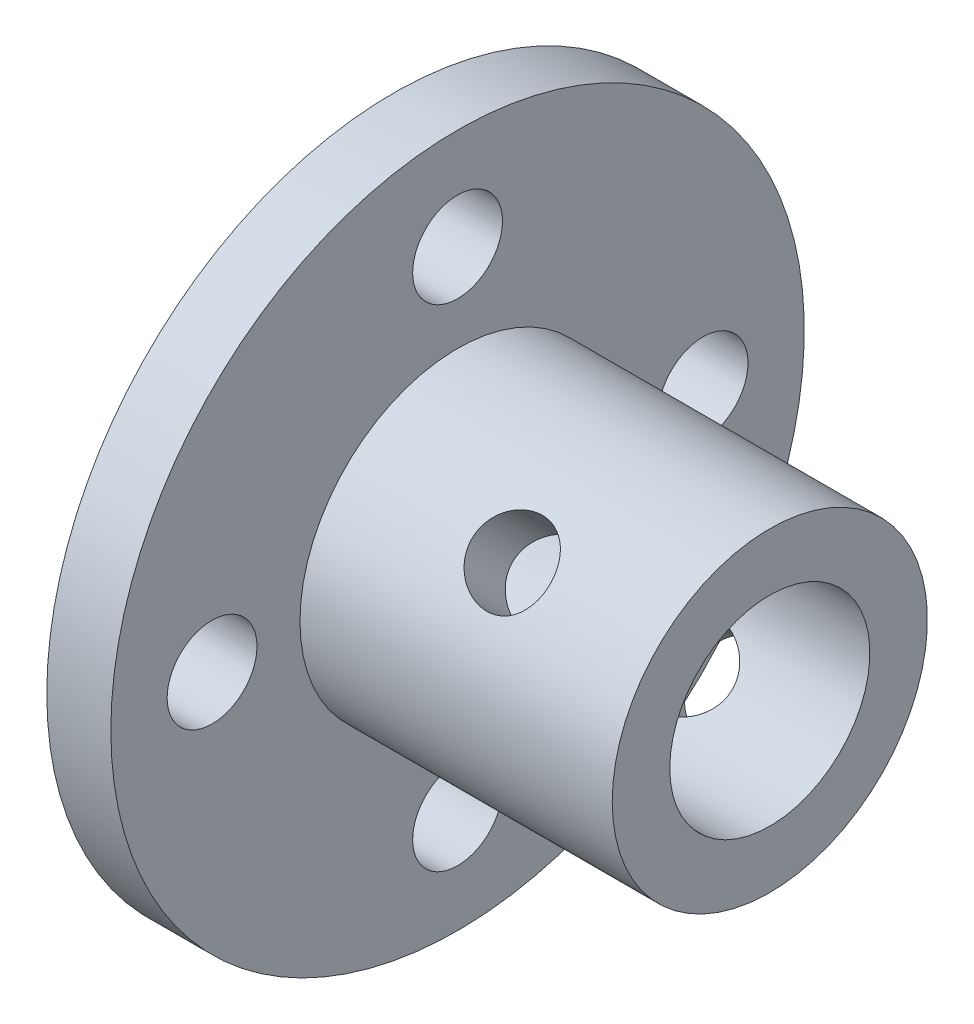
ISO-10303-21;
HEADER;
FILE_DESCRIPTION(('STEP AP214'),'2;1');
FILE_NAME('part.step','',(''),(''),'','','');
FILE_SCHEMA(('AUTOMOTIVE_DESIGN { 1 0 10303 214 1 1 1 1 }'));
ENDSEC;
DATA;
#1=APPLICATION_CONTEXT('core data for automotive mechanical design processes');
#2=APPLICATION_PROTOCOL_DEFINITION('international standard','automotive_design',2000,#1);
#3=PRODUCT_CONTEXT('',#1,'mechanical');
#4=PRODUCT('Part','Part','',(#3));
#5=PRODUCT_RELATED_PRODUCT_CATEGORY('part','',(#4));
#6=PRODUCT_DEFINITION_FORMATION('','',#4);
#7=PRODUCT_DEFINITION_CONTEXT('part definition',#1,'design');
#8=PRODUCT_DEFINITION('design','',#6,#7);
#9=PRODUCT_DEFINITION_SHAPE('','',#8);
#10=(LENGTH_UNIT() NAMED_UNIT(*) SI_UNIT(.MILLI.,.METRE.));
#11=(NAMED_UNIT(*) PLANE_ANGLE_UNIT() SI_UNIT($,.RADIAN.));
#12=(NAMED_UNIT(*) SI_UNIT($,.STERADIAN.) SOLID_ANGLE_UNIT());
#13=UNCERTAINTY_MEASURE_WITH_UNIT(LENGTH_MEASURE(1.E-05),#10,'distance_accuracy_value','');
#14=(GEOMETRIC_REPRESENTATION_CONTEXT(3) GLOBAL_UNCERTAINTY_ASSIGNED_CONTEXT((#13)) GLOBAL_UNIT_ASSIGNED_CONTEXT((#10,
#11,#12)) REPRESENTATION_CONTEXT('',''));
#15=CARTESIAN_POINT('',(0.,0.,0.));
#16=DIRECTION('',(0.,0.,1.));
#17=DIRECTION('',(1.,0.,0.));
#18=AXIS2_PLACEMENT_3D('',#15,#16,#17);
#19=CARTESIAN_POINT('',(-11.938,0.,0.));
#20=DIRECTION('',(1.,0.,0.));
#21=DIRECTION('',(0.,0.,1.));
#22=AXIS2_PLACEMENT_3D('',#19,#20,#21);
#23=PLANE('',#22);
#24=CARTESIAN_POINT('',(-11.938,0.,7.78885));
#25=DIRECTION('',(1.,0.,0.));
#26=DIRECTION('',(0.,0.,-1.));
#27=AXIS2_PLACEMENT_3D('',#24,#25,#26);
#28=CIRCLE('',#27,1.425);
#29=CARTESIAN_POINT('',(-11.938,0.,6.36385));
#30=VERTEX_POINT('',#29);
#31=EDGE_CURVE('E145',#30,#30,#28,.T.);
#32=ORIENTED_EDGE('',*,*,#31,.T.);
#33=EDGE_LOOP('',(#32));
#34=FACE_BOUND('',#33,.T.);
#35=CARTESIAN_POINT('',(-11.938,7.78885,0.));
#36=DIRECTION('',(1.,0.,0.));
#37=DIRECTION('',(0.,0.,-1.));
#38=AXIS2_PLACEMENT_3D('',#35,#36,#37);
#39=CIRCLE('',#38,1.425);
#40=CARTESIAN_POINT('',(-11.938,7.78885,-1.425));
#41=VERTEX_POINT('',#40);
#42=EDGE_CURVE('E150',#41,#41,#39,.T.);
#43=ORIENTED_EDGE('',*,*,#42,.T.);
#44=EDGE_LOOP('',(#43));
#45=FACE_BOUND('',#44,.T.);
#46=CARTESIAN_POINT('',(-11.938,0.,-7.78885));
#47=DIRECTION('',(1.,0.,0.));
#48=DIRECTION('',(0.,0.,-1.));
#49=AXIS2_PLACEMENT_3D('',#46,#47,#48);
#50=CIRCLE('',#49,1.425);
#51=CARTESIAN_POINT('',(-11.938,0.,-9.21385));
#52=VERTEX_POINT('',#51);
#53=EDGE_CURVE('E156',#52,#52,#50,.T.);
#54=ORIENTED_EDGE('',*,*,#53,.T.);
#55=EDGE_LOOP('',(#54));
#56=FACE_BOUND('',#55,.T.);
#57=CARTESIAN_POINT('',(-11.938,-7.78885,0.));
#58=DIRECTION('',(1.,0.,0.));
#59=DIRECTION('',(0.,0.,-1.));
#60=AXIS2_PLACEMENT_3D('',#57,#58,#59);
#61=CIRCLE('',#60,1.425);
#62=CARTESIAN_POINT('',(-11.938,-7.78885,-1.425));
#63=VERTEX_POINT('',#62);
#64=EDGE_CURVE('E160',#63,#63,#61,.T.);
#65=ORIENTED_EDGE('',*,*,#64,.T.);
#66=EDGE_LOOP('',(#65));
#67=FACE_BOUND('',#66,.T.);
#68=CARTESIAN_POINT('',(-11.938,0.,0.));
#69=DIRECTION('',(-1.,0.,0.));
#70=DIRECTION('',(0.,0.,1.));
#71=AXIS2_PLACEMENT_3D('',#68,#69,#70);
#72=CIRCLE('',#71,11.);
#73=CARTESIAN_POINT('',(-11.938,0.,11.));
#74=VERTEX_POINT('',#73);
#75=EDGE_CURVE('E114',#74,#74,#72,.T.);
#76=ORIENTED_EDGE('',*,*,#75,.T.);
#77=EDGE_LOOP('',(#76));
#78=FACE_BOUND('',#77,.T.);
#79=CARTESIAN_POINT('',(-11.938,0.,0.));
#80=DIRECTION('',(-1.,0.,0.));
#81=DIRECTION('',(0.,0.,1.));
#82=AXIS2_PLACEMENT_3D('',#79,#80,#81);
#83=CIRCLE('',#82,3.175);
#84=CARTESIAN_POINT('',(-11.938,0.,3.175));
#85=VERTEX_POINT('',#84);
#86=EDGE_CURVE('E10',#85,#85,#83,.T.);
#87=ORIENTED_EDGE('',*,*,#86,.F.);
#88=EDGE_LOOP('',(#87));
#89=FACE_BOUND('',#88,.T.);
#90=ADVANCED_FACE('F47',(#34,#45,#56,#67,#78,#89),#23,.F.);
#91=CARTESIAN_POINT('',(0.,0.,0.));
#92=DIRECTION('',(1.,0.,0.));
#93=DIRECTION('',(0.,0.,1.));
#94=AXIS2_PLACEMENT_3D('',#91,#92,#93);
#95=CYLINDRICAL_SURFACE('',#94,3.175);
#96=CARTESIAN_POINT('',(-4.6736,-1.18531571732124,-2.9454459170508));
#97=CARTESIAN_POINT('',(-4.60680522490351,-1.18532520272973,-2.94544545209878));
#98=CARTESIAN_POINT('',(-4.53990920844585,-1.19078350386495,-2.94326403595009));
#99=CARTESIAN_POINT('',(-4.40802877648725,-1.21227375963392,-2.93447496314475));
#100=CARTESIAN_POINT('',(-4.3430498277304,-1.22833337580284,-2.92785572637377));
#101=CARTESIAN_POINT('',(-4.217131851485,-1.26990844034985,-2.91006238398888));
#102=CARTESIAN_POINT('',(-4.15617893548869,-1.29538913822509,-2.89890500277562));
#103=CARTESIAN_POINT('',(-4.03950017006315,-1.35439201432014,-2.8718107110383));
#104=CARTESIAN_POINT('',(-3.98377303014912,-1.38791219990751,-2.85587498460957));
#105=CARTESIAN_POINT('',(-3.87603521099699,-1.46329487068606,-2.81802332836775));
#106=CARTESIAN_POINT('',(-3.82434744811579,-1.50548947169537,-2.7958492806207));
#107=CARTESIAN_POINT('',(-3.72910395410471,-1.59525148300168,-2.74562214224325));
#108=CARTESIAN_POINT('',(-3.68555100698427,-1.64282072377629,-2.71756704586478));
#109=CARTESIAN_POINT('',(-3.60623184754397,-1.743349979853,-2.65424385447025));
#110=CARTESIAN_POINT('',(-3.57082027751017,-1.79644548390872,-2.61874408121105));
#111=CARTESIAN_POINT('',(-3.51117491555398,-1.90427749052981,-2.54140605948194));
#112=CARTESIAN_POINT('',(-3.48693674520139,-1.95901334133551,-2.49957030239558));
#113=CARTESIAN_POINT('',(-3.45146999577126,-2.0653747958403,-2.41233472224327));
#114=CARTESIAN_POINT('',(-3.4396867273981,-2.11702627480597,-2.36719258174913));
#115=CARTESIAN_POINT('',(-3.42768103100303,-2.21794998646935,-2.27290233309657));
#116=CARTESIAN_POINT('',(-3.42745446806614,-2.26722306383974,-2.22375566403671));
#117=CARTESIAN_POINT('',(-3.43825829169136,-2.35924605982313,-2.12576115651534));
#118=CARTESIAN_POINT('',(-3.44868165688155,-2.40220452802739,-2.07704040672811));
#119=CARTESIAN_POINT('',(-3.47946069149615,-2.48360950603291,-1.97898242669964));
#120=CARTESIAN_POINT('',(-3.49981708715684,-2.52205568567102,-1.92964515163926));
#121=CARTESIAN_POINT('',(-3.55013667964265,-2.59440442842553,-1.83125059639351));
#122=CARTESIAN_POINT('',(-3.58023881445108,-2.62823055642144,-1.78220850301178));
#123=CARTESIAN_POINT('',(-3.64906769253263,-2.69045675978407,-1.68680652087235));
#124=CARTESIAN_POINT('',(-3.6877973393029,-2.71885500246174,-1.64044754172067));
#125=CARTESIAN_POINT('',(-3.77564429599532,-2.77192191396967,-1.54920440147364));
#126=CARTESIAN_POINT('',(-3.82526424355996,-2.79624033263148,-1.50459973223676));
#127=CARTESIAN_POINT('',(-3.9320390090984,-2.83908951903919,-1.42209763283211));
#128=CARTESIAN_POINT('',(-3.98919609048478,-2.85761854256676,-1.38420222550575));
#129=CARTESIAN_POINT('',(-4.11133665594227,-2.88963015677392,-1.31610027298299));
#130=CARTESIAN_POINT('',(-4.17648594791209,-2.90296782299005,-1.28612117098703));
#131=CARTESIAN_POINT('',(-4.31160169276774,-2.92419920276942,-1.23709591474252));
#132=CARTESIAN_POINT('',(-4.38156513397523,-2.93209628645096,-1.21804299360105));
#133=CARTESIAN_POINT('',(-4.5198933440829,-2.94235420122695,-1.19304223278875));
#134=CARTESIAN_POINT('',(-4.58810740835229,-2.94501520481247,-1.18638510359652));
#135=CARTESIAN_POINT('',(-4.72471011470498,-2.94578025926488,-1.18448579110348));
#136=CARTESIAN_POINT('',(-4.79309870150185,-2.9438856084566,-1.18924035556117));
#137=CARTESIAN_POINT('',(-4.92424640192953,-2.93572234091165,-1.20924071797064));
#138=CARTESIAN_POINT('',(-4.98711047186585,-2.92969442863371,-1.22390856337214));
#139=CARTESIAN_POINT('',(-5.10945356541915,-2.91339120092615,-1.26222303595051));
#140=CARTESIAN_POINT('',(-5.16893185386367,-2.9031149670083,-1.28587160467203));
#141=CARTESIAN_POINT('',(-5.28544017484311,-2.87761570183278,-1.34198951276894));
#142=CARTESIAN_POINT('',(-5.34227988066779,-2.8622128319736,-1.37477117113271));
#143=CARTESIAN_POINT('',(-5.44968640966026,-2.82631562941494,-1.44713314018884));
#144=CARTESIAN_POINT('',(-5.50025074645721,-2.805819288221,-1.48671613092727));
#145=CARTESIAN_POINT('',(-5.59736919264077,-2.7578253712521,-1.57406301044698));
#146=CARTESIAN_POINT('',(-5.6433903225675,-2.72993647155535,-1.62220666758443));
#147=CARTESIAN_POINT('',(-5.72583397828936,-2.6678058373493,-1.72247238524338));
#148=CARTESIAN_POINT('',(-5.76225624126449,-2.63356392893636,-1.77459455464741));
#149=CARTESIAN_POINT('',(-5.82429560293402,-2.55887297740001,-1.88068915478739));
#150=CARTESIAN_POINT('',(-5.84992767203841,-2.51843264107252,-1.93465890892788));
#151=CARTESIAN_POINT('',(-5.88943643103051,-2.43190049750743,-2.04236281961153));
#152=CARTESIAN_POINT('',(-5.90331921926974,-2.38581163632187,-2.096097083957));
#153=CARTESIAN_POINT('',(-5.91823232199299,-2.29220219615373,-2.19793438564197));
#154=CARTESIAN_POINT('',(-5.92001733258605,-2.24495480144677,-2.24617890964151));
#155=CARTESIAN_POINT('',(-5.91266033580021,-2.14791999458276,-2.33914016617591));
#156=CARTESIAN_POINT('',(-5.90351987097321,-2.09813294194631,-2.38385739577417));
#157=CARTESIAN_POINT('',(-5.87510837810324,-1.99912695504403,-2.46742743525798));
#158=CARTESIAN_POINT('',(-5.85613447113381,-1.94993247724703,-2.50641136283846));
#159=CARTESIAN_POINT('',(-5.80890131870109,-1.85231779514871,-2.5793917072627));
#160=CARTESIAN_POINT('',(-5.78064032907027,-1.8038977380807,-2.61338718551086));
#161=CARTESIAN_POINT('',(-5.71424284497286,-1.70735113304064,-2.67751421709143));
#162=CARTESIAN_POINT('',(-5.67572958018571,-1.65932937872352,-2.70741275173847));
#163=CARTESIAN_POINT('',(-5.59049371258272,-1.56756201616389,-2.76156082010736));
#164=CARTESIAN_POINT('',(-5.54376790764683,-1.52381808626401,-2.78580814177719));
#165=CARTESIAN_POINT('',(-5.44017566135291,-1.43989054856325,-2.83014580356028));
#166=CARTESIAN_POINT('',(-5.38287393853014,-1.40006858787561,-2.84990702768786));
#167=CARTESIAN_POINT('',(-5.26155214667444,-1.32909437065571,-2.88369302373458));
#168=CARTESIAN_POINT('',(-5.19753117513716,-1.29794328081982,-2.89771702380904));
#169=CARTESIAN_POINT('',(-5.07029276887839,-1.24846703280914,-2.91935271550661));
#170=CARTESIAN_POINT('',(-5.0074952384983,-1.22925806838964,-2.92741813313343));
#171=CARTESIAN_POINT('',(-4.87939625090234,-1.20083183794708,-2.93919613678769));
#172=CARTESIAN_POINT('',(-4.81410240502374,-1.19158637224899,-2.94292101029636));
#173=CARTESIAN_POINT('',(-4.72358618614704,-1.1860719314443,-2.94514073965111));
#174=CARTESIAN_POINT('',(-4.69860018443169,-1.18531216708903,-2.94544609107468));
#175=CARTESIAN_POINT('',(-4.6736,-1.18531571732124,-2.9454459170508));
#176=B_SPLINE_CURVE_WITH_KNOTS('',3,(#96,#97,#98,#99,#100,#101,#102,#103,#104,#105,#106,#107,
#108,#109,#110,#111,#112,#113,#114,#115,#116,#117,#118,#119,#120,#121,#122,#123,#124,#125,#126,
#127,#128,#129,#130,#131,#132,#133,#134,#135,#136,#137,#138,#139,#140,#141,#142,#143,#144,#145,
#146,#147,#148,#149,#150,#151,#152,#153,#154,#155,#156,#157,#158,#159,#160,#161,#162,#163,#164,
#165,#166,#167,#168,#169,#170,#171,#172,#173,#174,#175),.UNSPECIFIED.,.T.,.F.,(4,2,2,2,2,2,2,2,
2,2,2,2,2,2,2,2,2,2,2,2,2,2,2,2,2,2,2,2,2,2,2,2,2,2,2,2,2,2,2,4),(0.,0.200308972497923,
0.401142679110004,0.601242865189921,0.801293506468984,1.01129870362666,1.22137564051188,
1.43935693229591,1.65725273274284,1.86497275537982,2.0726184566056,2.26905486229901,
2.46550563225182,2.66489041602223,2.86434240226122,3.07643003108504,3.28858149580437,
3.50629093613605,3.72386539682898,3.92855458951893,4.13318545435149,4.32681159783578,
4.520479625253,4.72181972789519,4.92323935075629,5.13883990148124,5.35444635480381,
5.56975268000678,5.78494718387042,5.98658266933127,6.18818968953514,6.38403244399568,
6.5799119998918,6.78432982498044,6.98882753137341,7.20537454714852,7.4219506860219,
7.61957530389314,7.81663910411975,7.89161145410576),.UNSPECIFIED.);
#177=CARTESIAN_POINT('',(-4.6736,-1.18531571732124,-2.9454459170508));
#178=VERTEX_POINT('',#177);
#179=EDGE_CURVE('E107',#178,#178,#176,.T.);
#180=ORIENTED_EDGE('',*,*,#179,.T.);
#181=EDGE_LOOP('',(#180));
#182=FACE_BOUND('',#181,.T.);
#183=CARTESIAN_POINT('',(-4.6736,2.9454459170508,1.18531571732125));
#184=CARTESIAN_POINT('',(-4.74039477509649,2.94544545209878,1.18532520272974));
#185=CARTESIAN_POINT('',(-4.80729079155415,2.94326403595008,1.19078350386497));
#186=CARTESIAN_POINT('',(-4.93917122351275,2.93447496314474,1.21227375963393));
#187=CARTESIAN_POINT('',(-5.0041501722696,2.92785572637376,1.22833337580285));
#188=CARTESIAN_POINT('',(-5.130068148515,2.91006238398887,1.26990844034987));
#189=CARTESIAN_POINT('',(-5.19102106451131,2.89890500277562,1.2953891382251));
#190=CARTESIAN_POINT('',(-5.30769982993685,2.87181071103829,1.35439201432015));
#191=CARTESIAN_POINT('',(-5.36342696985088,2.85587498460957,1.38791219990752));
#192=CARTESIAN_POINT('',(-5.47116478900301,2.81802332836774,1.46329487068607));
#193=CARTESIAN_POINT('',(-5.52285255188421,2.7958492806207,1.50548947169538));
#194=CARTESIAN_POINT('',(-5.61809604589529,2.74562214224324,1.59525148300169));
#195=CARTESIAN_POINT('',(-5.66164899301573,2.71756704586478,1.6428207237763));
#196=CARTESIAN_POINT('',(-5.74096815245602,2.65424385447024,1.74334997985301));
#197=CARTESIAN_POINT('',(-5.77637972248983,2.61874408121104,1.79644548390873));
#198=CARTESIAN_POINT('',(-5.83602508444602,2.54140605948193,1.90427749052982));
#199=CARTESIAN_POINT('',(-5.8602632547986,2.49957030239558,1.95901334133552));
#200=CARTESIAN_POINT('',(-5.89573000422874,2.41233472224326,2.06537479584031));
#201=CARTESIAN_POINT('',(-5.90751327260189,2.36719258174912,2.11702627480598));
#202=CARTESIAN_POINT('',(-5.91951896899697,2.27290233309656,2.21794998646936));
#203=CARTESIAN_POINT('',(-5.91974553193385,2.2237556640367,2.26722306383975));
#204=CARTESIAN_POINT('',(-5.90894170830864,2.12576115651533,2.35924605982314));
#205=CARTESIAN_POINT('',(-5.89851834311844,2.0770404067281,2.40220452802739));
#206=CARTESIAN_POINT('',(-5.86773930850385,1.97898242669963,2.48360950603291));
#207=CARTESIAN_POINT('',(-5.84738291284315,1.92964515163925,2.52205568567103));
#208=CARTESIAN_POINT('',(-5.79706332035734,1.8312505963935,2.59440442842553));
#209=CARTESIAN_POINT('',(-5.76696118554892,1.78220850301177,2.62823055642145));
#210=CARTESIAN_POINT('',(-5.69813230746737,1.68680652087234,2.69045675978408));
#211=CARTESIAN_POINT('',(-5.6594026606971,1.64044754172066,2.71885500246174));
#212=CARTESIAN_POINT('',(-5.57155570400468,1.54920440147363,2.77192191396968));
#213=CARTESIAN_POINT('',(-5.52193575644004,1.50459973223675,2.79624033263149));
#214=CARTESIAN_POINT('',(-5.4151609909016,1.4220976328321,2.83908951903919));
#215=CARTESIAN_POINT('',(-5.35800390951522,1.38420222550574,2.85761854256676));
#216=CARTESIAN_POINT('',(-5.23586334405772,1.31610027298298,2.88963015677392));
#217=CARTESIAN_POINT('',(-5.17071405208791,1.28612117098702,2.90296782299006));
#218=CARTESIAN_POINT('',(-5.03559830723226,1.23709591474251,2.92419920276942));
#219=CARTESIAN_POINT('',(-4.96563486602477,1.21804299360104,2.93209628645096));
#220=CARTESIAN_POINT('',(-4.82730665591709,1.19304223278874,2.94235420122695));
#221=CARTESIAN_POINT('',(-4.75909259164771,1.18638510359651,2.94501520481247));
#222=CARTESIAN_POINT('',(-4.62248988529501,1.18448579110347,2.94578025926488));
#223=CARTESIAN_POINT('',(-4.55410129849815,1.18924035556116,2.9438856084566));
#224=CARTESIAN_POINT('',(-4.42295359807047,1.20924071797063,2.93572234091165));
#225=CARTESIAN_POINT('',(-4.36008952813414,1.22390856337214,2.92969442863371));
#226=CARTESIAN_POINT('',(-4.23774643458085,1.26222303595051,2.91339120092616));
#227=CARTESIAN_POINT('',(-4.17826814613632,1.28587160467202,2.90311496700831));
#228=CARTESIAN_POINT('',(-4.06175982515689,1.34198951276893,2.87761570183279));
#229=CARTESIAN_POINT('',(-4.0049201193322,1.3747711711327,2.8622128319736));
#230=CARTESIAN_POINT('',(-3.89751359033974,1.44713314018883,2.82631562941495));
#231=CARTESIAN_POINT('',(-3.84694925354279,1.48671613092726,2.80581928822101));
#232=CARTESIAN_POINT('',(-3.74983080735923,1.57406301044697,2.7578253712521));
#233=CARTESIAN_POINT('',(-3.7038096774325,1.62220666758443,2.72993647155536));
#234=CARTESIAN_POINT('',(-3.62136602171064,1.72247238524337,2.6678058373493));
#235=CARTESIAN_POINT('',(-3.5849437587355,1.7745945546474,2.63356392893636));
#236=CARTESIAN_POINT('',(-3.52290439706598,1.88068915478738,2.55887297740002));
#237=CARTESIAN_POINT('',(-3.49727232796159,1.93465890892787,2.51843264107253));
#238=CARTESIAN_POINT('',(-3.45776356896949,2.04236281961152,2.43190049750744));
#239=CARTESIAN_POINT('',(-3.44388078073026,2.096097083957,2.38581163632187));
#240=CARTESIAN_POINT('',(-3.42896767800701,2.19793438564196,2.29220219615373));
#241=CARTESIAN_POINT('',(-3.42718266741395,2.24617890964151,2.24495480144678));
#242=CARTESIAN_POINT('',(-3.43453966419979,2.33914016617591,2.14791999458277));
#243=CARTESIAN_POINT('',(-3.44368012902679,2.38385739577416,2.09813294194632));
#244=CARTESIAN_POINT('',(-3.47209162189676,2.46742743525797,1.99912695504404));
#245=CARTESIAN_POINT('',(-3.49106552886619,2.50641136283845,1.94993247724704));
#246=CARTESIAN_POINT('',(-3.53829868129891,2.57939170726269,1.85231779514872));
#247=CARTESIAN_POINT('',(-3.56655967092973,2.61338718551085,1.80389773808071));
#248=CARTESIAN_POINT('',(-3.63295715502714,2.67751421709142,1.70735113304064));
#249=CARTESIAN_POINT('',(-3.67147041981429,2.70741275173846,1.65932937872353));
#250=CARTESIAN_POINT('',(-3.75670628741728,2.76156082010735,1.5675620161639));
#251=CARTESIAN_POINT('',(-3.80343209235317,2.78580814177718,1.52381808626402));
#252=CARTESIAN_POINT('',(-3.90702433864709,2.83014580356027,1.43989054856326));
#253=CARTESIAN_POINT('',(-3.96432606146986,2.84990702768785,1.40006858787562));
#254=CARTESIAN_POINT('',(-4.08564785332556,2.88369302373457,1.32909437065572));
#255=CARTESIAN_POINT('',(-4.14966882486284,2.89771702380904,1.29794328081983));
#256=CARTESIAN_POINT('',(-4.27690723112161,2.91935271550661,1.24846703280915));
#257=CARTESIAN_POINT('',(-4.3397047615017,2.92741813313343,1.22925806838965));
#258=CARTESIAN_POINT('',(-4.46780374909766,2.93919613678769,1.20083183794708));
#259=CARTESIAN_POINT('',(-4.53309759497626,2.94292101029635,1.191586372249));
#260=CARTESIAN_POINT('',(-4.62361381385296,2.94514073965111,1.18607193144431));
#261=CARTESIAN_POINT('',(-4.64859981556831,2.94544609107468,1.18531216708904));
#262=CARTESIAN_POINT('',(-4.6736,2.9454459170508,1.18531571732125));
#263=B_SPLINE_CURVE_WITH_KNOTS('',3,(#183,#184,#185,#186,#187,#188,#189,#190,#191,#192,#193,
#194,#195,#196,#197,#198,#199,#200,#201,#202,#203,#204,#205,#206,#207,#208,#209,#210,#211,#212,
#213,#214,#215,#216,#217,#218,#219,#220,#221,#222,#223,#224,#225,#226,#227,#228,#229,#230,#231,
#232,#233,#234,#235,#236,#237,#238,#239,#240,#241,#242,#243,#244,#245,#246,#247,#248,#249,#250,
#251,#252,#253,#254,#255,#256,#257,#258,#259,#260,#261,#262),.UNSPECIFIED.,.T.,.F.,(4,2,2,2,2,2,
2,2,2,2,2,2,2,2,2,2,2,2,2,2,2,2,2,2,2,2,2,2,2,2,2,2,2,2,2,2,2,2,2,4),(0.,0.200308972497924,
0.401142679110004,0.60124286518992,0.801293506468986,1.01129870362666,1.22137564051188,
1.43935693229591,1.65725273274284,1.86497275537982,2.0726184566056,2.26905486229901,
2.46550563225182,2.66489041602223,2.86434240226122,3.07643003108504,3.28858149580437,
3.50629093613605,3.72386539682897,3.92855458951893,4.13318545435149,4.32681159783578,
4.520479625253,4.72181972789519,4.92323935075629,5.13883990148124,5.35444635480381,
5.56975268000678,5.78494718387042,5.98658266933127,6.18818968953514,6.38403244399568,
6.5799119998918,6.78432982498044,6.98882753137341,7.20537454714852,7.4219506860219,
7.61957530389314,7.81663910411975,7.89161145410576),.UNSPECIFIED.);
#264=CARTESIAN_POINT('',(-4.6736,2.9454459170508,1.18531571732125));
#265=VERTEX_POINT('',#264);
#266=EDGE_CURVE('E101',#265,#265,#263,.T.);
#267=ORIENTED_EDGE('',*,*,#266,.T.);
#268=EDGE_LOOP('',(#267));
#269=FACE_BOUND('',#268,.T.);
#270=CARTESIAN_POINT('',(0.,0.,0.));
#271=DIRECTION('',(-1.,0.,0.));
#272=DIRECTION('',(0.,0.,1.));
#273=AXIS2_PLACEMENT_3D('',#270,#271,#272);
#274=CIRCLE('',#273,3.175);
#275=CARTESIAN_POINT('',(0.,0.,3.175));
#276=VERTEX_POINT('',#275);
#277=EDGE_CURVE('E55',#276,#276,#274,.T.);
#278=ORIENTED_EDGE('',*,*,#277,.F.);
#279=EDGE_LOOP('',(#278));
#280=FACE_BOUND('',#279,.T.);
#281=ORIENTED_EDGE('',*,*,#86,.T.);
#282=EDGE_LOOP('',(#281));
#283=FACE_BOUND('',#282,.T.);
#284=ADVANCED_FACE('F94',(#182,#269,#280,#283),#95,.F.);
#285=CARTESIAN_POINT('',(0.,0.,0.));
#286=DIRECTION('',(1.,0.,0.));
#287=DIRECTION('',(0.,0.,1.));
#288=AXIS2_PLACEMENT_3D('',#285,#286,#287);
#289=PLANE('',#288);
#290=CARTESIAN_POINT('',(0.,0.,0.));
#291=DIRECTION('',(-1.,0.,0.));
#292=DIRECTION('',(0.,0.,1.));
#293=AXIS2_PLACEMENT_3D('',#290,#291,#292);
#294=CIRCLE('',#293,5.);
#295=CARTESIAN_POINT('',(0.,0.,5.));
#296=VERTEX_POINT('',#295);
#297=EDGE_CURVE('E63',#296,#296,#294,.T.);
#298=ORIENTED_EDGE('',*,*,#297,.F.);
#299=EDGE_LOOP('',(#298));
#300=FACE_BOUND('',#299,.T.);
#301=ORIENTED_EDGE('',*,*,#277,.T.);
#302=EDGE_LOOP('',(#301));
#303=FACE_BOUND('',#302,.T.);
#304=ADVANCED_FACE('F90',(#300,#303),#289,.T.);
#305=CARTESIAN_POINT('',(0.,0.,0.));
#306=DIRECTION('',(1.,0.,0.));
#307=DIRECTION('',(0.,0.,1.));
#308=AXIS2_PLACEMENT_3D('',#305,#306,#307);
#309=CYLINDRICAL_SURFACE('',#308,5.);
#310=CARTESIAN_POINT('',(-4.6736,-2.54418451428428,-4.30431471401384));
#311=CARTESIAN_POINT('',(-4.74233747659569,-2.54418683886107,-4.30431425312239));
#312=CARTESIAN_POINT('',(-4.81109681366802,-2.54927094697424,-4.30132060746434));
#313=CARTESIAN_POINT('',(-4.94664164633323,-2.56935170193778,-4.2893546961686));
#314=CARTESIAN_POINT('',(-5.01342595905155,-2.58435416828725,-4.28037892054994));
#315=CARTESIAN_POINT('',(-5.14304054888859,-2.62349802646578,-4.25649846690144));
#316=CARTESIAN_POINT('',(-5.20587578213003,-2.64762768527287,-4.24160139945839));
#317=CARTESIAN_POINT('',(-5.32603137173596,-2.70391991730028,-4.2059389678755));
#318=CARTESIAN_POINT('',(-5.38335150624985,-2.73608281347898,-4.1851733678));
#319=CARTESIAN_POINT('',(-5.4921004095178,-2.80780407432814,-4.13740548068463));
#320=CARTESIAN_POINT('',(-5.54339111801696,-2.84749546331676,-4.11028855279339));
#321=CARTESIAN_POINT('',(-5.63740919413911,-2.93227056487006,-4.05024480353233));
#322=CARTESIAN_POINT('',(-5.68013576643808,-2.97735477762888,-4.01731744309961));
#323=CARTESIAN_POINT('',(-5.7563768896044,-3.07189333406017,-3.94550854974877));
#324=CARTESIAN_POINT('',(-5.78975591609629,-3.12139947836655,-3.90655099293851));
#325=CARTESIAN_POINT('',(-5.84547340873617,-3.22241352385637,-3.82365188899287));
#326=CARTESIAN_POINT('',(-5.86781348936917,-3.27392113112948,-3.77971107183347));
#327=CARTESIAN_POINT('',(-5.90037701639497,-3.37607448782454,-3.68872653300695));
#328=CARTESIAN_POINT('',(-5.91083488382858,-3.4267167615226,-3.64176288985187));
#329=CARTESIAN_POINT('',(-5.92007285236867,-3.52652533586116,-3.5451992177467));
#330=CARTESIAN_POINT('',(-5.91885466570091,-3.57569185185225,-3.49559957641132));
#331=CARTESIAN_POINT('',(-5.90494392537234,-3.67005065474344,-3.39636804379531));
#332=CARTESIAN_POINT('',(-5.89250439349453,-3.71530657747822,-3.34676086749195));
#333=CARTESIAN_POINT('',(-5.85691064890498,-3.80193943733464,-3.24801072473233));
#334=CARTESIAN_POINT('',(-5.8337558685929,-3.84331616883094,-3.19886778300789));
#335=CARTESIAN_POINT('',(-5.77718349776776,-3.92174677313142,-3.10222719219546));
#336=CARTESIAN_POINT('',(-5.74367564930393,-3.95875850796946,-3.05474827178967));
#337=CARTESIAN_POINT('',(-5.66741673164585,-4.02749826437284,-2.9635324435579));
#338=CARTESIAN_POINT('',(-5.62466406674643,-4.05922537210733,-2.91979618355654));
#339=CARTESIAN_POINT('',(-5.52977194688045,-4.11785614423098,-2.8365342365553));
#340=CARTESIAN_POINT('',(-5.47741137625877,-4.1446075168514,-2.79715304298196));
#341=CARTESIAN_POINT('',(-5.36549798662897,-4.19201783677206,-2.72558882272796));
#342=CARTESIAN_POINT('',(-5.30594483756966,-4.21267650434199,-2.69340612656351));
#343=CARTESIAN_POINT('',(-5.18092779446906,-4.2478839058459,-2.63753352985458));
#344=CARTESIAN_POINT('',(-5.11543705273619,-4.26240301538235,-2.61388488610475));
#345=CARTESIAN_POINT('',(-4.98064850313861,-4.28512221003283,-2.5764727637386));
#346=CARTESIAN_POINT('',(-4.91135150534535,-4.29332363417689,-2.56270719045286));
#347=CARTESIAN_POINT('',(-4.77286268288603,-4.30324427785362,-2.54601282114654));
#348=CARTESIAN_POINT('',(-4.70371564719401,-4.30512766063774,-2.54280961886341));
#349=CARTESIAN_POINT('',(-4.56580929374429,-4.30286484608128,-2.54663681728799));
#350=CARTESIAN_POINT('',(-4.4970499412116,-4.29871919846564,-2.55366628498436));
#351=CARTESIAN_POINT('',(-4.36301968231966,-4.28453387511392,-2.57739275360853));
#352=CARTESIAN_POINT('',(-4.2977103237505,-4.27459069695955,-2.59393141659041));
#353=CARTESIAN_POINT('',(-4.17115753089037,-4.24892645017495,-2.63575838754024));
#354=CARTESIAN_POINT('',(-4.10991457604785,-4.23320470164682,-2.6610477250789));
#355=CARTESIAN_POINT('',(-3.99191805263366,-4.19568276248211,-2.71983105006527));
#356=CARTESIAN_POINT('',(-3.93527508369207,-4.17377020407792,-2.75347516934076));
#357=CARTESIAN_POINT('',(-3.82927136243125,-4.12411396178364,-2.82730599189673));
#358=CARTESIAN_POINT('',(-3.77991179844253,-4.09636932814252,-2.86749376056727));
#359=CARTESIAN_POINT('',(-3.68862171957703,-4.03449286065678,-2.95393918047931));
#360=CARTESIAN_POINT('',(-3.64690562163092,-4.00021978045273,-3.00032257275524));
#361=CARTESIAN_POINT('',(-3.57364302682335,-3.9261646676356,-3.09659710711247));
#362=CARTESIAN_POINT('',(-3.54209600073801,-3.8863829218613,-3.14648806648656));
#363=CARTESIAN_POINT('',(-3.49033977144148,-3.80229109762081,-3.24759451938151));
#364=CARTESIAN_POINT('',(-3.47004928663153,-3.75801628833074,-3.29879764798364));
#365=CARTESIAN_POINT('',(-3.44113769092944,-3.66569351886474,-3.40109285120233));
#366=CARTESIAN_POINT('',(-3.43251434868407,-3.61764628202983,-3.45218494518769));
#367=CARTESIAN_POINT('',(-3.42730643148228,-3.52042409979299,-3.55123955006206));
#368=CARTESIAN_POINT('',(-3.43040529642031,-3.47131392314548,-3.59924924126436));
#369=CARTESIAN_POINT('',(-3.44782937764122,-3.37223396902058,-3.69224252981819));
#370=CARTESIAN_POINT('',(-3.46215426529903,-3.32226421674787,-3.73722621570965));
#371=CARTESIAN_POINT('',(-3.50145459780948,-3.22333349003306,-3.8228763455399));
#372=CARTESIAN_POINT('',(-3.52637324691974,-3.17436857514154,-3.86356438785802));
#373=CARTESIAN_POINT('',(-3.58610213305335,-3.07878787961191,-3.94015487634811));
#374=CARTESIAN_POINT('',(-3.62091360752686,-3.03217239371294,-3.97605672300997));
#375=CARTESIAN_POINT('',(-3.70040786264168,-2.94181787134349,-4.04338479354824));
#376=CARTESIAN_POINT('',(-3.74530571710361,-2.89817360953665,-4.07468427025185));
#377=CARTESIAN_POINT('',(-3.84328007667724,-2.81663691055121,-4.13146834363347));
#378=CARTESIAN_POINT('',(-3.89635864776122,-2.77874593112832,-4.15695146739536));
#379=CARTESIAN_POINT('',(-4.01036672283177,-2.70961378136281,-4.20234924517746));
#380=CARTESIAN_POINT('',(-4.07142302360577,-2.67850821888005,-4.22215246967227));
#381=CARTESIAN_POINT('',(-4.19891082709298,-2.62529720590364,-4.25544436154556));
#382=CARTESIAN_POINT('',(-4.26533835235788,-2.60318516746962,-4.26893765216871));
#383=CARTESIAN_POINT('',(-4.38864696001823,-2.57230257388647,-4.2876003516234));
#384=CARTESIAN_POINT('',(-4.44493482231432,-2.56179256033778,-4.29386601631127));
#385=CARTESIAN_POINT('',(-4.55867676151226,-2.54773285006191,-4.30222321549406));
#386=CARTESIAN_POINT('',(-4.61613074039889,-2.54418257077814,-4.30431509935081));
#387=CARTESIAN_POINT('',(-4.6736,-2.54418451428428,-4.30431471401384));
#388=B_SPLINE_CURVE_WITH_KNOTS('',3,(#310,#311,#312,#313,#314,#315,#316,#317,#318,#319,#320,
#321,#322,#323,#324,#325,#326,#327,#328,#329,#330,#331,#332,#333,#334,#335,#336,#337,#338,#339,
#340,#341,#342,#343,#344,#345,#346,#347,#348,#349,#350,#351,#352,#353,#354,#355,#356,#357,#358,
#359,#360,#361,#362,#363,#364,#365,#366,#367,#368,#369,#370,#371,#372,#373,#374,#375,#376,#377,
#378,#379,#380,#381,#382,#383,#384,#385,#386,#387),.UNSPECIFIED.,.T.,.F.,(4,2,2,2,2,2,2,2,2,2,2,
2,2,2,2,2,2,2,2,2,2,2,2,2,2,2,2,2,2,2,2,2,2,2,2,2,2,2,4),(0.,0.206001400921096,
0.412123778536182,0.617982081043713,0.823848660957197,1.03376462184588,1.24370006793777,
1.4565379083884,1.66934461132926,1.87787575263332,2.08637631452014,2.29028993445966,
2.49421435719988,2.6999692990411,2.90575978368354,3.11707289026207,3.32839569720876,
3.54072684798053,3.75301298288666,3.95973864940787,4.1664454679344,4.36980616167729,
4.57319079019702,4.78053458498982,4.98791217182959,5.20042890984226,5.41293458616743,
5.62388512929112,5.83479532219673,6.04005103092486,6.2453007313228,6.44946364567621,
6.65365210912263,6.8626966624811,7.07179409507718,7.2847499130653,7.4975494543859,
7.66979521678851,7.84202656094102),.UNSPECIFIED.);
#389=CARTESIAN_POINT('',(-4.6736,-2.54418451428428,-4.30431471401384));
#390=VERTEX_POINT('',#389);
#391=EDGE_CURVE('E75',#390,#390,#388,.T.);
#392=ORIENTED_EDGE('',*,*,#391,.T.);
#393=EDGE_LOOP('',(#392));
#394=FACE_BOUND('',#393,.T.);
#395=CARTESIAN_POINT('',(-4.6736,4.30431471401384,2.54418451428429));
#396=CARTESIAN_POINT('',(-4.60486252340431,4.30431425312238,2.54418683886109));
#397=CARTESIAN_POINT('',(-4.53610318633198,4.30132060746434,2.54927094697425));
#398=CARTESIAN_POINT('',(-4.40055835366676,4.28935469616859,2.56935170193779));
#399=CARTESIAN_POINT('',(-4.33377404094845,4.28037892054993,2.58435416828726));
#400=CARTESIAN_POINT('',(-4.20415945111141,4.25649846690143,2.6234980264658));
#401=CARTESIAN_POINT('',(-4.14132421786997,4.24160139945838,2.64762768527288));
#402=CARTESIAN_POINT('',(-4.02116862826403,4.20593896787549,2.70391991730029));
#403=CARTESIAN_POINT('',(-3.96384849375015,4.18517336779999,2.736082813479));
#404=CARTESIAN_POINT('',(-3.8550995904822,4.13740548068462,2.80780407432816));
#405=CARTESIAN_POINT('',(-3.80380888198304,4.11028855279338,2.84749546331677));
#406=CARTESIAN_POINT('',(-3.70979080586089,4.05024480353232,2.93227056487007));
#407=CARTESIAN_POINT('',(-3.66706423356192,4.0173174430996,2.97735477762889));
#408=CARTESIAN_POINT('',(-3.5908231103956,3.94550854974876,3.07189333406019));
#409=CARTESIAN_POINT('',(-3.55744408390371,3.9065509929385,3.12139947836657));
#410=CARTESIAN_POINT('',(-3.50172659126383,3.82365188899286,3.22241352385638));
#411=CARTESIAN_POINT('',(-3.47938651063083,3.77971107183346,3.27392113112949));
#412=CARTESIAN_POINT('',(-3.44682298360503,3.68872653300694,3.37607448782455));
#413=CARTESIAN_POINT('',(-3.43636511617142,3.64176288985186,3.42671676152261));
#414=CARTESIAN_POINT('',(-3.42712714763133,3.54519921774669,3.52652533586117));
#415=CARTESIAN_POINT('',(-3.42834533429909,3.49559957641131,3.57569185185226));
#416=CARTESIAN_POINT('',(-3.44225607462766,3.39636804379529,3.67005065474345));
#417=CARTESIAN_POINT('',(-3.45469560650547,3.34676086749194,3.71530657747823));
#418=CARTESIAN_POINT('',(-3.49028935109501,3.24801072473232,3.80193943733465));
#419=CARTESIAN_POINT('',(-3.5134441314071,3.19886778300788,3.84331616883095));
#420=CARTESIAN_POINT('',(-3.57001650223223,3.10222719219545,3.92174677313143));
#421=CARTESIAN_POINT('',(-3.60352435069607,3.05474827178966,3.95875850796947));
#422=CARTESIAN_POINT('',(-3.67978326835415,2.96353244355788,4.02749826437285));
#423=CARTESIAN_POINT('',(-3.72253593325357,2.91979618355652,4.05922537210734));
#424=CARTESIAN_POINT('',(-3.81742805311955,2.83653423655529,4.11785614423099));
#425=CARTESIAN_POINT('',(-3.86978862374122,2.79715304298194,4.14460751685141));
#426=CARTESIAN_POINT('',(-3.98170201337103,2.72558882272795,4.19201783677207));
#427=CARTESIAN_POINT('',(-4.04125516243034,2.6934061265635,4.212676504342));
#428=CARTESIAN_POINT('',(-4.16627220553094,2.63753352985457,4.24788390584591));
#429=CARTESIAN_POINT('',(-4.23176294726381,2.61388488610473,4.26240301538236));
#430=CARTESIAN_POINT('',(-4.36655149686139,2.57647276373858,4.28512221003284));
#431=CARTESIAN_POINT('',(-4.43584849465465,2.56270719045284,4.29332363417689));
#432=CARTESIAN_POINT('',(-4.57433731711397,2.54601282114653,4.30324427785363));
#433=CARTESIAN_POINT('',(-4.64348435280598,2.5428096188634,4.30512766063775));
#434=CARTESIAN_POINT('',(-4.78139070625571,2.54663681728797,4.30286484608129));
#435=CARTESIAN_POINT('',(-4.8501500587884,2.55366628498434,4.29871919846565));
#436=CARTESIAN_POINT('',(-4.98418031768034,2.57739275360852,4.28453387511393));
#437=CARTESIAN_POINT('',(-5.0494896762495,2.59393141659039,4.27459069695956));
#438=CARTESIAN_POINT('',(-5.17604246910963,2.63575838754023,4.24892645017496));
#439=CARTESIAN_POINT('',(-5.23728542395215,2.66104772507888,4.23320470164683));
#440=CARTESIAN_POINT('',(-5.35528194736634,2.71983105006525,4.19568276248213));
#441=CARTESIAN_POINT('',(-5.41192491630793,2.75347516934074,4.17377020407793));
#442=CARTESIAN_POINT('',(-5.51792863756875,2.82730599189672,4.12411396178365));
#443=CARTESIAN_POINT('',(-5.56728820155747,2.86749376056726,4.09636932814253));
#444=CARTESIAN_POINT('',(-5.65857828042297,2.95393918047929,4.03449286065679));
#445=CARTESIAN_POINT('',(-5.70029437836908,3.00032257275523,4.00021978045274));
#446=CARTESIAN_POINT('',(-5.77355697317665,3.09659710711245,3.92616466763561));
#447=CARTESIAN_POINT('',(-5.80510399926199,3.14648806648654,3.88638292186131));
#448=CARTESIAN_POINT('',(-5.85686022855852,3.24759451938149,3.80229109762082));
#449=CARTESIAN_POINT('',(-5.87715071336847,3.29879764798363,3.75801628833075));
#450=CARTESIAN_POINT('',(-5.90606230907056,3.40109285120232,3.66569351886475));
#451=CARTESIAN_POINT('',(-5.91468565131593,3.45218494518768,3.61764628202984));
#452=CARTESIAN_POINT('',(-5.91989356851772,3.55123955006204,3.520424099793));
#453=CARTESIAN_POINT('',(-5.91679470357969,3.59924924126434,3.47131392314549));
#454=CARTESIAN_POINT('',(-5.89937062235878,3.69224252981817,3.3722339690206));
#455=CARTESIAN_POINT('',(-5.88504573470096,3.73722621570964,3.32226421674788));
#456=CARTESIAN_POINT('',(-5.84574540219051,3.82287634553989,3.22333349003308));
#457=CARTESIAN_POINT('',(-5.82082675308026,3.86356438785801,3.17436857514155));
#458=CARTESIAN_POINT('',(-5.76109786694665,3.9401548763481,3.07878787961192));
#459=CARTESIAN_POINT('',(-5.72628639247313,3.97605672300996,3.03217239371295));
#460=CARTESIAN_POINT('',(-5.64679213735832,4.04338479354823,2.94181787134351));
#461=CARTESIAN_POINT('',(-5.60189428289639,4.07468427025184,2.89817360953667));
#462=CARTESIAN_POINT('',(-5.50391992332276,4.13146834363346,2.81663691055122));
#463=CARTESIAN_POINT('',(-5.45084135223878,4.15695146739535,2.77874593112833));
#464=CARTESIAN_POINT('',(-5.33683327716823,4.20234924517745,2.70961378136282));
#465=CARTESIAN_POINT('',(-5.27577697639423,4.22215246967226,2.67850821888006));
#466=CARTESIAN_POINT('',(-5.14828917290702,4.25544436154555,2.62529720590366));
#467=CARTESIAN_POINT('',(-5.08186164764212,4.2689376521687,2.60318516746964));
#468=CARTESIAN_POINT('',(-4.95855303998177,4.2876003516234,2.57230257388649));
#469=CARTESIAN_POINT('',(-4.90226517768568,4.29386601631126,2.56179256033779));
#470=CARTESIAN_POINT('',(-4.78852323848774,4.30222321549406,2.54773285006193));
#471=CARTESIAN_POINT('',(-4.73106925960111,4.3043150993508,2.54418257077816));
#472=CARTESIAN_POINT('',(-4.6736,4.30431471401384,2.54418451428429));
#473=B_SPLINE_CURVE_WITH_KNOTS('',3,(#395,#396,#397,#398,#399,#400,#401,#402,#403,#404,#405,
#406,#407,#408,#409,#410,#411,#412,#413,#414,#415,#416,#417,#418,#419,#420,#421,#422,#423,#424,
#425,#426,#427,#428,#429,#430,#431,#432,#433,#434,#435,#436,#437,#438,#439,#440,#441,#442,#443,
#444,#445,#446,#447,#448,#449,#450,#451,#452,#453,#454,#455,#456,#457,#458,#459,#460,#461,#462,
#463,#464,#465,#466,#467,#468,#469,#470,#471,#472),.UNSPECIFIED.,.T.,.F.,(4,2,2,2,2,2,2,2,2,2,2,
2,2,2,2,2,2,2,2,2,2,2,2,2,2,2,2,2,2,2,2,2,2,2,2,2,2,2,4),(0.,0.206001400921096,
0.412123778536182,0.617982081043713,0.823848660957198,1.03376462184588,1.24370006793777,
1.4565379083884,1.66934461132926,1.87787575263332,2.08637631452014,2.29028993445966,
2.49421435719988,2.6999692990411,2.90575978368354,3.11707289026207,3.32839569720876,
3.54072684798053,3.75301298288666,3.95973864940787,4.1664454679344,4.36980616167729,
4.57319079019702,4.78053458498982,4.98791217182959,5.20042890984226,5.41293458616744,
5.62388512929112,5.83479532219673,6.04005103092486,6.2453007313228,6.44946364567621,
6.65365210912263,6.8626966624811,7.07179409507717,7.2847499130653,7.4975494543859,
7.66979521678851,7.84202656094102),.UNSPECIFIED.);
#474=CARTESIAN_POINT('',(-4.6736,4.30431471401384,2.54418451428429));
#475=VERTEX_POINT('',#474);
#476=EDGE_CURVE('E67',#475,#475,#473,.T.);
#477=ORIENTED_EDGE('',*,*,#476,.T.);
#478=EDGE_LOOP('',(#477));
#479=FACE_BOUND('',#478,.T.);
#480=CARTESIAN_POINT('',(-9.906,0.,0.));
#481=DIRECTION('',(-1.,0.,0.));
#482=DIRECTION('',(0.,0.,1.));
#483=AXIS2_PLACEMENT_3D('',#480,#481,#482);
#484=CIRCLE('',#483,5.);
#485=CARTESIAN_POINT('',(-9.906,0.,5.));
#486=VERTEX_POINT('',#485);
#487=EDGE_CURVE('E122',#486,#486,#484,.T.);
#488=ORIENTED_EDGE('',*,*,#487,.F.);
#489=EDGE_LOOP('',(#488));
#490=FACE_BOUND('',#489,.T.);
#491=ORIENTED_EDGE('',*,*,#297,.T.);
#492=EDGE_LOOP('',(#491));
#493=FACE_BOUND('',#492,.T.);
#494=ADVANCED_FACE('F84',(#394,#479,#490,#493),#309,.T.);
#495=CARTESIAN_POINT('',(-9.906,0.,0.));
#496=DIRECTION('',(1.,0.,0.));
#497=DIRECTION('',(0.,0.,1.));
#498=AXIS2_PLACEMENT_3D('',#495,#496,#497);
#499=PLANE('',#498);
#500=CARTESIAN_POINT('',(-9.906,0.,7.78885));
#501=DIRECTION('',(-1.,0.,0.));
#502=DIRECTION('',(0.,0.,1.));
#503=AXIS2_PLACEMENT_3D('',#500,#501,#502);
#504=CIRCLE('',#503,1.425);
#505=CARTESIAN_POINT('',(-9.906,0.,9.21385));
#506=VERTEX_POINT('',#505);
#507=EDGE_CURVE('E50',#506,#506,#504,.T.);
#508=ORIENTED_EDGE('',*,*,#507,.T.);
#509=EDGE_LOOP('',(#508));
#510=FACE_BOUND('',#509,.T.);
#511=CARTESIAN_POINT('',(-9.906,7.78885,0.));
#512=DIRECTION('',(-1.,0.,0.));
#513=DIRECTION('',(0.,0.,1.));
#514=AXIS2_PLACEMENT_3D('',#511,#512,#513);
#515=CIRCLE('',#514,1.425);
#516=CARTESIAN_POINT('',(-9.906,7.78885,1.425));
#517=VERTEX_POINT('',#516);
#518=EDGE_CURVE('E133',#517,#517,#515,.T.);
#519=ORIENTED_EDGE('',*,*,#518,.T.);
#520=EDGE_LOOP('',(#519));
#521=FACE_BOUND('',#520,.T.);
#522=CARTESIAN_POINT('',(-9.906,0.,-7.78885));
#523=DIRECTION('',(-1.,0.,0.));
#524=DIRECTION('',(0.,0.,1.));
#525=AXIS2_PLACEMENT_3D('',#522,#523,#524);
#526=CIRCLE('',#525,1.425);
#527=CARTESIAN_POINT('',(-9.906,0.,-6.36385));
#528=VERTEX_POINT('',#527);
#529=EDGE_CURVE('E135',#528,#528,#526,.T.);
#530=ORIENTED_EDGE('',*,*,#529,.T.);
#531=EDGE_LOOP('',(#530));
#532=FACE_BOUND('',#531,.T.);
#533=CARTESIAN_POINT('',(-9.906,-7.78885,0.));
#534=DIRECTION('',(-1.,0.,0.));
#535=DIRECTION('',(0.,0.,1.));
#536=AXIS2_PLACEMENT_3D('',#533,#534,#535);
#537=CIRCLE('',#536,1.425);
#538=CARTESIAN_POINT('',(-9.906,-7.78885,1.425));
#539=VERTEX_POINT('',#538);
#540=EDGE_CURVE('E141',#539,#539,#537,.T.);
#541=ORIENTED_EDGE('',*,*,#540,.T.);
#542=EDGE_LOOP('',(#541));
#543=FACE_BOUND('',#542,.T.);
#544=CARTESIAN_POINT('',(-9.906,0.,0.));
#545=DIRECTION('',(-1.,0.,0.));
#546=DIRECTION('',(0.,0.,1.));
#547=AXIS2_PLACEMENT_3D('',#544,#545,#546);
#548=CIRCLE('',#547,11.);
#549=CARTESIAN_POINT('',(-9.906,0.,11.));
#550=VERTEX_POINT('',#549);
#551=EDGE_CURVE('E118',#550,#550,#548,.T.);
#552=ORIENTED_EDGE('',*,*,#551,.F.);
#553=EDGE_LOOP('',(#552));
#554=FACE_BOUND('',#553,.T.);
#555=ORIENTED_EDGE('',*,*,#487,.T.);
#556=EDGE_LOOP('',(#555));
#557=FACE_BOUND('',#556,.T.);
#558=ADVANCED_FACE('F89',(#510,#521,#532,#543,#554,#557),#499,.T.);
#559=CARTESIAN_POINT('',(0.,0.,0.));
#560=DIRECTION('',(1.,0.,0.));
#561=DIRECTION('',(0.,0.,1.));
#562=AXIS2_PLACEMENT_3D('',#559,#560,#561);
#563=CYLINDRICAL_SURFACE('',#562,11.);
#564=ORIENTED_EDGE('',*,*,#75,.F.);
#565=EDGE_LOOP('',(#564));
#566=FACE_BOUND('',#565,.T.);
#567=ORIENTED_EDGE('',*,*,#551,.T.);
#568=EDGE_LOOP('',(#567));
#569=FACE_BOUND('',#568,.T.);
#570=ADVANCED_FACE('F203',(#566,#569),#563,.T.);
#571=CARTESIAN_POINT('',(-4.6736,-11.,-11.));
#572=DIRECTION('',(0.,0.707106781186546,0.707106781186549));
#573=DIRECTION('',(0.,0.707106781186549,-0.707106781186546));
#574=AXIS2_PLACEMENT_3D('',#571,#572,#573);
#575=CYLINDRICAL_SURFACE('',#574,1.2446);
#576=ORIENTED_EDGE('',*,*,#266,.F.);
#577=EDGE_LOOP('',(#576));
#578=FACE_BOUND('',#577,.T.);
#579=ORIENTED_EDGE('',*,*,#476,.F.);
#580=EDGE_LOOP('',(#579));
#581=FACE_BOUND('',#580,.T.);
#582=ADVANCED_FACE('F80',(#578,#581),#575,.F.);
#583=ORIENTED_EDGE('',*,*,#179,.F.);
#584=EDGE_LOOP('',(#583));
#585=FACE_BOUND('',#584,.T.);
#586=ORIENTED_EDGE('',*,*,#391,.F.);
#587=EDGE_LOOP('',(#586));
#588=FACE_BOUND('',#587,.T.);
#589=ADVANCED_FACE('F169',(#585,#588),#575,.F.);
#590=CARTESIAN_POINT('',(0.,-7.78885,0.));
#591=DIRECTION('',(-1.,0.,0.));
#592=DIRECTION('',(0.,0.,-1.));
#593=AXIS2_PLACEMENT_3D('',#590,#591,#592);
#594=CYLINDRICAL_SURFACE('',#593,1.425);
#595=ORIENTED_EDGE('',*,*,#540,.F.);
#596=EDGE_LOOP('',(#595));
#597=FACE_BOUND('',#596,.T.);
#598=ORIENTED_EDGE('',*,*,#64,.F.);
#599=EDGE_LOOP('',(#598));
#600=FACE_BOUND('',#599,.T.);
#601=ADVANCED_FACE('F166',(#597,#600),#594,.F.);
#602=CARTESIAN_POINT('',(0.,0.,-7.78885));
#603=DIRECTION('',(-1.,0.,0.));
#604=DIRECTION('',(0.,0.,-1.));
#605=AXIS2_PLACEMENT_3D('',#602,#603,#604);
#606=CYLINDRICAL_SURFACE('',#605,1.425);
#607=ORIENTED_EDGE('',*,*,#529,.F.);
#608=EDGE_LOOP('',(#607));
#609=FACE_BOUND('',#608,.T.);
#610=ORIENTED_EDGE('',*,*,#53,.F.);
#611=EDGE_LOOP('',(#610));
#612=FACE_BOUND('',#611,.T.);
#613=ADVANCED_FACE('F168',(#609,#612),#606,.F.);
#614=CARTESIAN_POINT('',(0.,7.78885,0.));
#615=DIRECTION('',(-1.,0.,0.));
#616=DIRECTION('',(0.,0.,-1.));
#617=AXIS2_PLACEMENT_3D('',#614,#615,#616);
#618=CYLINDRICAL_SURFACE('',#617,1.425);
#619=ORIENTED_EDGE('',*,*,#518,.F.);
#620=EDGE_LOOP('',(#619));
#621=FACE_BOUND('',#620,.T.);
#622=ORIENTED_EDGE('',*,*,#42,.F.);
#623=EDGE_LOOP('',(#622));
#624=FACE_BOUND('',#623,.T.);
#625=ADVANCED_FACE('F175',(#621,#624),#618,.F.);
#626=CARTESIAN_POINT('',(0.,0.,7.78885));
#627=DIRECTION('',(-1.,0.,0.));
#628=DIRECTION('',(0.,0.,-1.));
#629=AXIS2_PLACEMENT_3D('',#626,#627,#628);
#630=CYLINDRICAL_SURFACE('',#629,1.425);
#631=ORIENTED_EDGE('',*,*,#507,.F.);
#632=EDGE_LOOP('',(#631));
#633=FACE_BOUND('',#632,.T.);
#634=ORIENTED_EDGE('',*,*,#31,.F.);
#635=EDGE_LOOP('',(#634));
#636=FACE_BOUND('',#635,.T.);
#637=ADVANCED_FACE('F190',(#633,#636),#630,.F.);
#638=CLOSED_SHELL('',(#90,#284,#304,#494,#558,#570,#582,#589,#601,#613,#625,#637));
#639=MANIFOLD_SOLID_BREP('B2',#638);
#640=ADVANCED_BREP_SHAPE_REPRESENTATION('',(#18,#639),#14);
#641=SHAPE_DEFINITION_REPRESENTATION(#9,#640);
ENDSEC;
END-ISO-10303-21;
